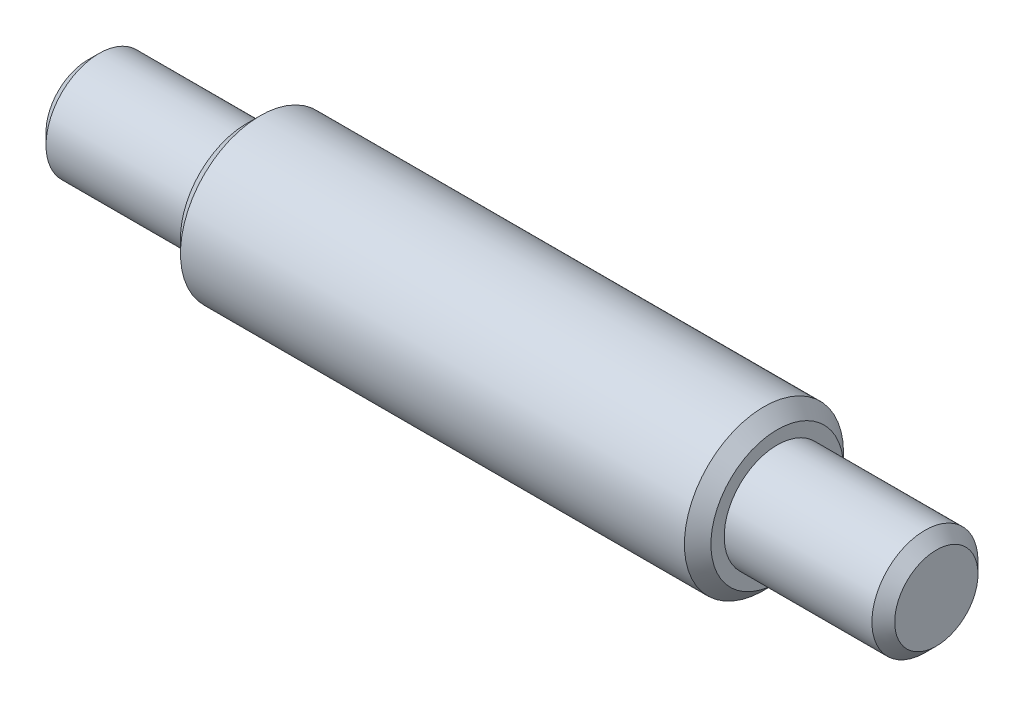
ISO-10303-21;
HEADER;
FILE_DESCRIPTION(('STEP AP214'),'2;1');
FILE_NAME('part.step','',(''),(''),'','','');
FILE_SCHEMA(('AUTOMOTIVE_DESIGN { 1 0 10303 214 1 1 1 1 }'));
ENDSEC;
DATA;
#1=APPLICATION_CONTEXT('core data for automotive mechanical design processes');
#2=APPLICATION_PROTOCOL_DEFINITION('international standard','automotive_design',2000,#1);
#3=PRODUCT_CONTEXT('',#1,'mechanical');
#4=PRODUCT('Part','Part','',(#3));
#5=PRODUCT_RELATED_PRODUCT_CATEGORY('part','',(#4));
#6=PRODUCT_DEFINITION_FORMATION('','',#4);
#7=PRODUCT_DEFINITION_CONTEXT('part definition',#1,'design');
#8=PRODUCT_DEFINITION('design','',#6,#7);
#9=PRODUCT_DEFINITION_SHAPE('','',#8);
#10=(LENGTH_UNIT() NAMED_UNIT(*) SI_UNIT(.MILLI.,.METRE.));
#11=(NAMED_UNIT(*) PLANE_ANGLE_UNIT() SI_UNIT($,.RADIAN.));
#12=(NAMED_UNIT(*) SI_UNIT($,.STERADIAN.) SOLID_ANGLE_UNIT());
#13=UNCERTAINTY_MEASURE_WITH_UNIT(LENGTH_MEASURE(1.E-05),#10,'distance_accuracy_value','');
#14=(GEOMETRIC_REPRESENTATION_CONTEXT(3) GLOBAL_UNCERTAINTY_ASSIGNED_CONTEXT((#13)) GLOBAL_UNIT_ASSIGNED_CONTEXT((#10,
#11,#12)) REPRESENTATION_CONTEXT('',''));
#15=CARTESIAN_POINT('',(0.,0.,0.));
#16=DIRECTION('',(0.,0.,1.));
#17=DIRECTION('',(1.,0.,0.));
#18=AXIS2_PLACEMENT_3D('',#15,#16,#17);
#19=CARTESIAN_POINT('',(-5.5705,2.86095834308928E-11,0.));
#20=DIRECTION('',(1.,0.,0.));
#21=DIRECTION('',(0.,0.,-1.));
#22=AXIS2_PLACEMENT_3D('',#19,#20,#21);
#23=CONICAL_SURFACE('',#22,1.99999999997139,0.785398163397449);
#24=CARTESIAN_POINT('',(-6.00000000001432,2.86095834308928E-11,0.));
#25=DIRECTION('',(1.,0.,0.));
#26=DIRECTION('',(0.,0.,-1.));
#27=AXIS2_PLACEMENT_3D('',#24,#25,#26);
#28=CIRCLE('',#27,1.57049999995706);
#29=CARTESIAN_POINT('',(-6.00000000001432,2.86095834308928E-11,-1.57049999995706));
#30=VERTEX_POINT('',#29);
#31=EDGE_CURVE('E64',#30,#30,#28,.T.);
#32=ORIENTED_EDGE('',*,*,#31,.T.);
#33=EDGE_LOOP('',(#32));
#34=FACE_BOUND('',#33,.T.);
#35=CARTESIAN_POINT('',(-5.5705,2.86095834308928E-11,0.));
#36=DIRECTION('',(1.,0.,0.));
#37=DIRECTION('',(0.,0.,-1.));
#38=AXIS2_PLACEMENT_3D('',#35,#36,#37);
#39=CIRCLE('',#38,1.99999999997139);
#40=CARTESIAN_POINT('',(-5.5705,2.86095834308928E-11,-1.99999999997139));
#41=VERTEX_POINT('',#40);
#42=EDGE_CURVE('E10',#41,#41,#39,.T.);
#43=ORIENTED_EDGE('',*,*,#42,.F.);
#44=EDGE_LOOP('',(#43));
#45=FACE_BOUND('',#44,.T.);
#46=ADVANCED_FACE('F30',(#34,#45),#23,.T.);
#47=CARTESIAN_POINT('',(-6.00000000001432,2.86095834308928E-11,0.));
#48=DIRECTION('',(1.,0.,0.));
#49=DIRECTION('',(0.,0.,-1.));
#50=AXIS2_PLACEMENT_3D('',#47,#48,#49);
#51=CYLINDRICAL_SURFACE('',#50,1.99999999997139);
#52=ORIENTED_EDGE('',*,*,#42,.T.);
#53=EDGE_LOOP('',(#52));
#54=FACE_BOUND('',#53,.T.);
#55=CARTESIAN_POINT('',(0.,2.86095834308928E-11,0.));
#56=DIRECTION('',(1.,0.,0.));
#57=DIRECTION('',(0.,0.,-1.));
#58=AXIS2_PLACEMENT_3D('',#55,#56,#57);
#59=CIRCLE('',#58,1.99999999997139);
#60=CARTESIAN_POINT('',(0.,2.86095834308928E-11,-1.99999999997139));
#61=VERTEX_POINT('',#60);
#62=EDGE_CURVE('E36',#61,#61,#59,.T.);
#63=ORIENTED_EDGE('',*,*,#62,.F.);
#64=EDGE_LOOP('',(#63));
#65=FACE_BOUND('',#64,.T.);
#66=ADVANCED_FACE('F81',(#54,#65),#51,.T.);
#67=CARTESIAN_POINT('',(0.,2.50000000005457,0.));
#68=DIRECTION('',(-1.,0.,0.));
#69=DIRECTION('',(0.,0.,1.));
#70=AXIS2_PLACEMENT_3D('',#67,#68,#69);
#71=PLANE('',#70);
#72=ORIENTED_EDGE('',*,*,#62,.T.);
#73=EDGE_LOOP('',(#72));
#74=FACE_BOUND('',#73,.T.);
#75=CARTESIAN_POINT('',(0.,2.86095834308928E-11,0.));
#76=DIRECTION('',(1.,0.,0.));
#77=DIRECTION('',(0.,0.,-1.));
#78=AXIS2_PLACEMENT_3D('',#75,#76,#77);
#79=CIRCLE('',#78,2.50000000002596);
#80=CARTESIAN_POINT('',(0.,2.86095834308928E-11,-2.50000000002596));
#81=VERTEX_POINT('',#80);
#82=EDGE_CURVE('E40',#81,#81,#79,.T.);
#83=ORIENTED_EDGE('',*,*,#82,.F.);
#84=EDGE_LOOP('',(#83));
#85=FACE_BOUND('',#84,.T.);
#86=ADVANCED_FACE('F85',(#74,#85),#71,.T.);
#87=CARTESIAN_POINT('',(0.499999999945431,2.86095834308928E-11,0.));
#88=DIRECTION('',(1.,0.,0.));
#89=DIRECTION('',(0.,0.,-1.));
#90=AXIS2_PLACEMENT_3D('',#87,#88,#89);
#91=CONICAL_SURFACE('',#90,2.99999999997139,0.785398163397447);
#92=ORIENTED_EDGE('',*,*,#82,.T.);
#93=EDGE_LOOP('',(#92));
#94=FACE_BOUND('',#93,.T.);
#95=CARTESIAN_POINT('',(0.499999999945431,2.86095834308928E-11,0.));
#96=DIRECTION('',(1.,0.,0.));
#97=DIRECTION('',(0.,0.,-1.));
#98=AXIS2_PLACEMENT_3D('',#95,#96,#97);
#99=CIRCLE('',#98,2.99999999997139);
#100=CARTESIAN_POINT('',(0.499999999945431,2.86095834308928E-11,-2.99999999997139));
#101=VERTEX_POINT('',#100);
#102=EDGE_CURVE('E44',#101,#101,#99,.T.);
#103=ORIENTED_EDGE('',*,*,#102,.F.);
#104=EDGE_LOOP('',(#103));
#105=FACE_BOUND('',#104,.T.);
#106=ADVANCED_FACE('F89',(#94,#105),#91,.T.);
#107=CARTESIAN_POINT('',(-6.00000000001432,2.86095834308928E-11,0.));
#108=DIRECTION('',(1.,0.,0.));
#109=DIRECTION('',(0.,0.,-1.));
#110=AXIS2_PLACEMENT_3D('',#107,#108,#109);
#111=CYLINDRICAL_SURFACE('',#110,2.99999999997139);
#112=ORIENTED_EDGE('',*,*,#102,.T.);
#113=EDGE_LOOP('',(#112));
#114=FACE_BOUND('',#113,.T.);
#115=CARTESIAN_POINT('',(19.5,2.86095834308928E-11,0.));
#116=DIRECTION('',(1.,0.,0.));
#117=DIRECTION('',(0.,0.,-1.));
#118=AXIS2_PLACEMENT_3D('',#115,#116,#117);
#119=CIRCLE('',#118,2.99999999997139);
#120=CARTESIAN_POINT('',(19.5,2.86095834308928E-11,-2.99999999997139));
#121=VERTEX_POINT('',#120);
#122=EDGE_CURVE('E49',#121,#121,#119,.T.);
#123=ORIENTED_EDGE('',*,*,#122,.F.);
#124=EDGE_LOOP('',(#123));
#125=FACE_BOUND('',#124,.T.);
#126=ADVANCED_FACE('F95',(#114,#125),#111,.T.);
#127=CARTESIAN_POINT('',(20.0000000000193,2.86095834308928E-11,0.));
#128=DIRECTION('',(-1.,0.,0.));
#129=DIRECTION('',(0.,0.,1.));
#130=AXIS2_PLACEMENT_3D('',#127,#128,#129);
#131=CONICAL_SURFACE('',#130,2.49999999995207,0.785398163397447);
#132=ORIENTED_EDGE('',*,*,#122,.T.);
#133=EDGE_LOOP('',(#132));
#134=FACE_BOUND('',#133,.T.);
#135=CARTESIAN_POINT('',(20.0000000000193,2.86095834308928E-11,0.));
#136=DIRECTION('',(1.,0.,0.));
#137=DIRECTION('',(0.,0.,-1.));
#138=AXIS2_PLACEMENT_3D('',#135,#136,#137);
#139=CIRCLE('',#138,2.49999999995207);
#140=CARTESIAN_POINT('',(20.0000000000193,2.86095834308928E-11,-2.49999999995207));
#141=VERTEX_POINT('',#140);
#142=EDGE_CURVE('E52',#141,#141,#139,.T.);
#143=ORIENTED_EDGE('',*,*,#142,.F.);
#144=EDGE_LOOP('',(#143));
#145=FACE_BOUND('',#144,.T.);
#146=ADVANCED_FACE('F99',(#134,#145),#131,.T.);
#147=CARTESIAN_POINT('',(20.0000000000193,2.,0.));
#148=DIRECTION('',(1.,0.,0.));
#149=DIRECTION('',(0.,0.,-1.));
#150=AXIS2_PLACEMENT_3D('',#147,#148,#149);
#151=PLANE('',#150);
#152=ORIENTED_EDGE('',*,*,#142,.T.);
#153=EDGE_LOOP('',(#152));
#154=FACE_BOUND('',#153,.T.);
#155=CARTESIAN_POINT('',(20.0000000000193,2.86095834308928E-11,0.));
#156=DIRECTION('',(1.,0.,0.));
#157=DIRECTION('',(0.,0.,-1.));
#158=AXIS2_PLACEMENT_3D('',#155,#156,#157);
#159=CIRCLE('',#158,1.99999999997139);
#160=CARTESIAN_POINT('',(20.0000000000193,2.86095834308928E-11,-1.99999999997139));
#161=VERTEX_POINT('',#160);
#162=EDGE_CURVE('E55',#161,#161,#159,.T.);
#163=ORIENTED_EDGE('',*,*,#162,.F.);
#164=EDGE_LOOP('',(#163));
#165=FACE_BOUND('',#164,.T.);
#166=ADVANCED_FACE('F103',(#154,#165),#151,.T.);
#167=CARTESIAN_POINT('',(-6.00000000001432,2.86095834308928E-11,0.));
#168=DIRECTION('',(1.,0.,0.));
#169=DIRECTION('',(0.,0.,-1.));
#170=AXIS2_PLACEMENT_3D('',#167,#168,#169);
#171=CYLINDRICAL_SURFACE('',#170,1.99999999997139);
#172=ORIENTED_EDGE('',*,*,#162,.T.);
#173=EDGE_LOOP('',(#172));
#174=FACE_BOUND('',#173,.T.);
#175=CARTESIAN_POINT('',(25.5705000000244,2.86095834308928E-11,0.));
#176=DIRECTION('',(1.,0.,0.));
#177=DIRECTION('',(0.,0.,-1.));
#178=AXIS2_PLACEMENT_3D('',#175,#176,#177);
#179=CIRCLE('',#178,1.99999999997139);
#180=CARTESIAN_POINT('',(25.5705000000244,2.86095834308928E-11,-1.99999999997139));
#181=VERTEX_POINT('',#180);
#182=EDGE_CURVE('E58',#181,#181,#179,.T.);
#183=ORIENTED_EDGE('',*,*,#182,.F.);
#184=EDGE_LOOP('',(#183));
#185=FACE_BOUND('',#184,.T.);
#186=ADVANCED_FACE('F107',(#174,#185),#171,.T.);
#187=CARTESIAN_POINT('',(26.0000000000337,2.86095834308928E-11,0.));
#188=DIRECTION('',(-1.,0.,0.));
#189=DIRECTION('',(0.,0.,1.));
#190=AXIS2_PLACEMENT_3D('',#187,#188,#189);
#191=CONICAL_SURFACE('',#190,1.57049999996211,0.78539816339745);
#192=ORIENTED_EDGE('',*,*,#182,.T.);
#193=EDGE_LOOP('',(#192));
#194=FACE_BOUND('',#193,.T.);
#195=CARTESIAN_POINT('',(26.0000000000337,2.86095834308928E-11,0.));
#196=DIRECTION('',(1.,0.,0.));
#197=DIRECTION('',(0.,0.,-1.));
#198=AXIS2_PLACEMENT_3D('',#195,#196,#197);
#199=CIRCLE('',#198,1.57049999996211);
#200=CARTESIAN_POINT('',(26.0000000000337,2.86095834308928E-11,-1.57049999996211));
#201=VERTEX_POINT('',#200);
#202=EDGE_CURVE('E61',#201,#201,#199,.T.);
#203=ORIENTED_EDGE('',*,*,#202,.F.);
#204=EDGE_LOOP('',(#203));
#205=FACE_BOUND('',#204,.T.);
#206=ADVANCED_FACE('F77',(#194,#205),#191,.T.);
#207=CARTESIAN_POINT('',(26.0000000000337,2.86095834308928E-11,0.));
#208=DIRECTION('',(1.,0.,0.));
#209=DIRECTION('',(0.,0.,-1.));
#210=AXIS2_PLACEMENT_3D('',#207,#208,#209);
#211=PLANE('',#210);
#212=ORIENTED_EDGE('',*,*,#202,.T.);
#213=EDGE_LOOP('',(#212));
#214=FACE_BOUND('',#213,.T.);
#215=ADVANCED_FACE('F72',(#214),#211,.T.);
#216=CARTESIAN_POINT('',(-6.00000000001432,1.57049999998567,0.));
#217=DIRECTION('',(-1.,0.,0.));
#218=DIRECTION('',(0.,0.,1.));
#219=AXIS2_PLACEMENT_3D('',#216,#217,#218);
#220=PLANE('',#219);
#221=ORIENTED_EDGE('',*,*,#31,.F.);
#222=EDGE_LOOP('',(#221));
#223=FACE_BOUND('',#222,.T.);
#224=ADVANCED_FACE('F70',(#223),#220,.T.);
#225=CLOSED_SHELL('',(#46,#66,#86,#106,#126,#146,#166,#186,#206,#215,#224));
#226=MANIFOLD_SOLID_BREP('B2',#225);
#227=ADVANCED_BREP_SHAPE_REPRESENTATION('',(#18,#226),#14);
#228=SHAPE_DEFINITION_REPRESENTATION(#9,#227);
ENDSEC;
END-ISO-10303-21;
